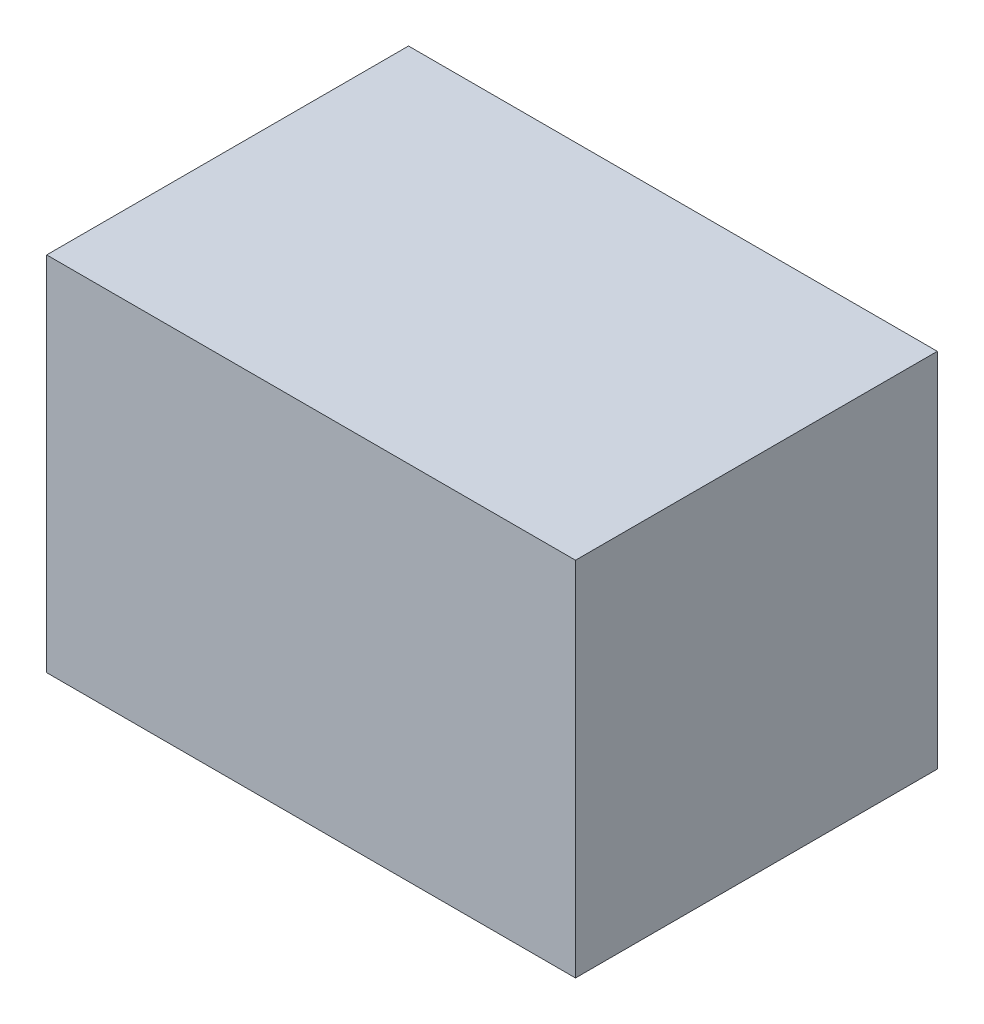
ISO-10303-21;
HEADER;
FILE_DESCRIPTION(('STEP AP214'),'2;1');
FILE_NAME('part.step','',(''),(''),'','','');
FILE_SCHEMA(('AUTOMOTIVE_DESIGN { 1 0 10303 214 1 1 1 1 }'));
ENDSEC;
DATA;
#1=APPLICATION_CONTEXT('core data for automotive mechanical design processes');
#2=APPLICATION_PROTOCOL_DEFINITION('international standard','automotive_design',2000,#1);
#3=PRODUCT_CONTEXT('',#1,'mechanical');
#4=PRODUCT('Part','Part','',(#3));
#5=PRODUCT_RELATED_PRODUCT_CATEGORY('part','',(#4));
#6=PRODUCT_DEFINITION_FORMATION('','',#4);
#7=PRODUCT_DEFINITION_CONTEXT('part definition',#1,'design');
#8=PRODUCT_DEFINITION('design','',#6,#7);
#9=PRODUCT_DEFINITION_SHAPE('','',#8);
#10=(LENGTH_UNIT() NAMED_UNIT(*) SI_UNIT(.MILLI.,.METRE.));
#11=(NAMED_UNIT(*) PLANE_ANGLE_UNIT() SI_UNIT($,.RADIAN.));
#12=(NAMED_UNIT(*) SI_UNIT($,.STERADIAN.) SOLID_ANGLE_UNIT());
#13=UNCERTAINTY_MEASURE_WITH_UNIT(LENGTH_MEASURE(1.E-05),#10,'distance_accuracy_value','');
#14=(GEOMETRIC_REPRESENTATION_CONTEXT(3) GLOBAL_UNCERTAINTY_ASSIGNED_CONTEXT((#13)) GLOBAL_UNIT_ASSIGNED_CONTEXT((#10,
#11,#12)) REPRESENTATION_CONTEXT('',''));
#15=CARTESIAN_POINT('',(0.,0.,0.));
#16=DIRECTION('',(0.,0.,1.));
#17=DIRECTION('',(1.,0.,0.));
#18=AXIS2_PLACEMENT_3D('',#15,#16,#17);
#19=CARTESIAN_POINT('',(47.5,-32.5,65.));
#20=DIRECTION('',(-1.,0.,0.));
#21=DIRECTION('',(0.,0.,1.));
#22=AXIS2_PLACEMENT_3D('',#19,#20,#21);
#23=PLANE('',#22);
#24=DIRECTION('',(0.,1.,0.));
#25=VECTOR('',#24,1.);
#26=CARTESIAN_POINT('',(47.5,-32.5,0.));
#27=LINE('',#26,#25);
#28=CARTESIAN_POINT('',(47.5,-32.5,0.));
#29=VERTEX_POINT('',#28);
#30=CARTESIAN_POINT('',(47.5,32.5,0.));
#31=VERTEX_POINT('',#30);
#32=EDGE_CURVE('E102',#29,#31,#27,.T.);
#33=ORIENTED_EDGE('',*,*,#32,.T.);
#34=DIRECTION('',(0.,0.,-1.));
#35=VECTOR('',#34,1.);
#36=CARTESIAN_POINT('',(47.5,32.5,65.));
#37=LINE('',#36,#35);
#38=CARTESIAN_POINT('',(47.5,32.5,65.));
#39=VERTEX_POINT('',#38);
#40=EDGE_CURVE('E11',#39,#31,#37,.T.);
#41=ORIENTED_EDGE('',*,*,#40,.F.);
#42=DIRECTION('',(0.,1.,0.));
#43=VECTOR('',#42,1.);
#44=CARTESIAN_POINT('',(47.5,-32.5,65.));
#45=LINE('',#44,#43);
#46=CARTESIAN_POINT('',(47.5,-32.5,65.));
#47=VERTEX_POINT('',#46);
#48=EDGE_CURVE('E90',#47,#39,#45,.T.);
#49=ORIENTED_EDGE('',*,*,#48,.F.);
#50=DIRECTION('',(0.,0.,-1.));
#51=VECTOR('',#50,1.);
#52=CARTESIAN_POINT('',(47.5,-32.5,65.));
#53=LINE('',#52,#51);
#54=EDGE_CURVE('E98',#47,#29,#53,.T.);
#55=ORIENTED_EDGE('',*,*,#54,.T.);
#56=EDGE_LOOP('',(#33,#41,#49,#55));
#57=FACE_BOUND('',#56,.T.);
#58=ADVANCED_FACE('F39',(#57),#23,.F.);
#59=CARTESIAN_POINT('',(-47.5,32.5,65.));
#60=DIRECTION('',(0.,-1.,0.));
#61=DIRECTION('',(0.,0.,-1.));
#62=AXIS2_PLACEMENT_3D('',#59,#60,#61);
#63=PLANE('',#62);
#64=DIRECTION('',(-1.,0.,0.));
#65=VECTOR('',#64,1.);
#66=CARTESIAN_POINT('',(-47.5,32.5,0.));
#67=LINE('',#66,#65);
#68=CARTESIAN_POINT('',(-47.5,32.5,0.));
#69=VERTEX_POINT('',#68);
#70=EDGE_CURVE('E94',#31,#69,#67,.T.);
#71=ORIENTED_EDGE('',*,*,#70,.T.);
#72=DIRECTION('',(0.,0.,-1.));
#73=VECTOR('',#72,1.);
#74=CARTESIAN_POINT('',(-47.5,32.5,65.));
#75=LINE('',#74,#73);
#76=CARTESIAN_POINT('',(-47.5,32.5,65.));
#77=VERTEX_POINT('',#76);
#78=EDGE_CURVE('E47',#77,#69,#75,.T.);
#79=ORIENTED_EDGE('',*,*,#78,.F.);
#80=DIRECTION('',(-1.,0.,0.));
#81=VECTOR('',#80,1.);
#82=CARTESIAN_POINT('',(-47.5,32.5,65.));
#83=LINE('',#82,#81);
#84=EDGE_CURVE('E85',#39,#77,#83,.T.);
#85=ORIENTED_EDGE('',*,*,#84,.F.);
#86=ORIENTED_EDGE('',*,*,#40,.T.);
#87=EDGE_LOOP('',(#71,#79,#85,#86));
#88=FACE_BOUND('',#87,.T.);
#89=ADVANCED_FACE('F93',(#88),#63,.F.);
#90=CARTESIAN_POINT('',(-47.5,-32.5,65.));
#91=DIRECTION('',(1.,0.,0.));
#92=DIRECTION('',(0.,0.,-1.));
#93=AXIS2_PLACEMENT_3D('',#90,#91,#92);
#94=PLANE('',#93);
#95=DIRECTION('',(0.,-1.,0.));
#96=VECTOR('',#95,1.);
#97=CARTESIAN_POINT('',(-47.5,-32.5,0.));
#98=LINE('',#97,#96);
#99=CARTESIAN_POINT('',(-47.5,-32.5,0.));
#100=VERTEX_POINT('',#99);
#101=EDGE_CURVE('E72',#69,#100,#98,.T.);
#102=ORIENTED_EDGE('',*,*,#101,.T.);
#103=DIRECTION('',(0.,0.,-1.));
#104=VECTOR('',#103,1.);
#105=CARTESIAN_POINT('',(-47.5,-32.5,65.));
#106=LINE('',#105,#104);
#107=CARTESIAN_POINT('',(-47.5,-32.5,65.));
#108=VERTEX_POINT('',#107);
#109=EDGE_CURVE('E95',#108,#100,#106,.T.);
#110=ORIENTED_EDGE('',*,*,#109,.F.);
#111=DIRECTION('',(0.,-1.,0.));
#112=VECTOR('',#111,1.);
#113=CARTESIAN_POINT('',(-47.5,-32.5,65.));
#114=LINE('',#113,#112);
#115=EDGE_CURVE('E88',#77,#108,#114,.T.);
#116=ORIENTED_EDGE('',*,*,#115,.F.);
#117=ORIENTED_EDGE('',*,*,#78,.T.);
#118=EDGE_LOOP('',(#102,#110,#116,#117));
#119=FACE_BOUND('',#118,.T.);
#120=ADVANCED_FACE('F96',(#119),#94,.F.);
#121=CARTESIAN_POINT('',(-47.5,-32.5,65.));
#122=DIRECTION('',(0.,1.,0.));
#123=DIRECTION('',(0.,0.,1.));
#124=AXIS2_PLACEMENT_3D('',#121,#122,#123);
#125=PLANE('',#124);
#126=DIRECTION('',(1.,0.,0.));
#127=VECTOR('',#126,1.);
#128=CARTESIAN_POINT('',(-47.5,-32.5,0.));
#129=LINE('',#128,#127);
#130=EDGE_CURVE('E78',#100,#29,#129,.T.);
#131=ORIENTED_EDGE('',*,*,#130,.T.);
#132=ORIENTED_EDGE('',*,*,#54,.F.);
#133=DIRECTION('',(1.,0.,0.));
#134=VECTOR('',#133,1.);
#135=CARTESIAN_POINT('',(-47.5,-32.5,65.));
#136=LINE('',#135,#134);
#137=EDGE_CURVE('E55',#108,#47,#136,.T.);
#138=ORIENTED_EDGE('',*,*,#137,.F.);
#139=ORIENTED_EDGE('',*,*,#109,.T.);
#140=EDGE_LOOP('',(#131,#132,#138,#139));
#141=FACE_BOUND('',#140,.T.);
#142=ADVANCED_FACE('F109',(#141),#125,.F.);
#143=CARTESIAN_POINT('',(0.,0.,65.));
#144=DIRECTION('',(0.,0.,-1.));
#145=DIRECTION('',(-1.,0.,0.));
#146=AXIS2_PLACEMENT_3D('',#143,#144,#145);
#147=PLANE('',#146);
#148=ORIENTED_EDGE('',*,*,#48,.T.);
#149=ORIENTED_EDGE('',*,*,#84,.T.);
#150=ORIENTED_EDGE('',*,*,#115,.T.);
#151=ORIENTED_EDGE('',*,*,#137,.T.);
#152=EDGE_LOOP('',(#148,#149,#150,#151));
#153=FACE_BOUND('',#152,.T.);
#154=ADVANCED_FACE('F86',(#153),#147,.F.);
#155=CARTESIAN_POINT('',(0.,0.,0.));
#156=DIRECTION('',(0.,0.,-1.));
#157=DIRECTION('',(-1.,0.,0.));
#158=AXIS2_PLACEMENT_3D('',#155,#156,#157);
#159=PLANE('',#158);
#160=ORIENTED_EDGE('',*,*,#32,.F.);
#161=ORIENTED_EDGE('',*,*,#130,.F.);
#162=ORIENTED_EDGE('',*,*,#101,.F.);
#163=ORIENTED_EDGE('',*,*,#70,.F.);
#164=EDGE_LOOP('',(#160,#161,#162,#163));
#165=FACE_BOUND('',#164,.T.);
#166=ADVANCED_FACE('F112',(#165),#159,.T.);
#167=CLOSED_SHELL('',(#58,#89,#120,#142,#154,#166));
#168=MANIFOLD_SOLID_BREP('B2',#167);
#169=ADVANCED_BREP_SHAPE_REPRESENTATION('',(#18,#168),#14);
#170=SHAPE_DEFINITION_REPRESENTATION(#9,#169);
ENDSEC;
END-ISO-10303-21;
